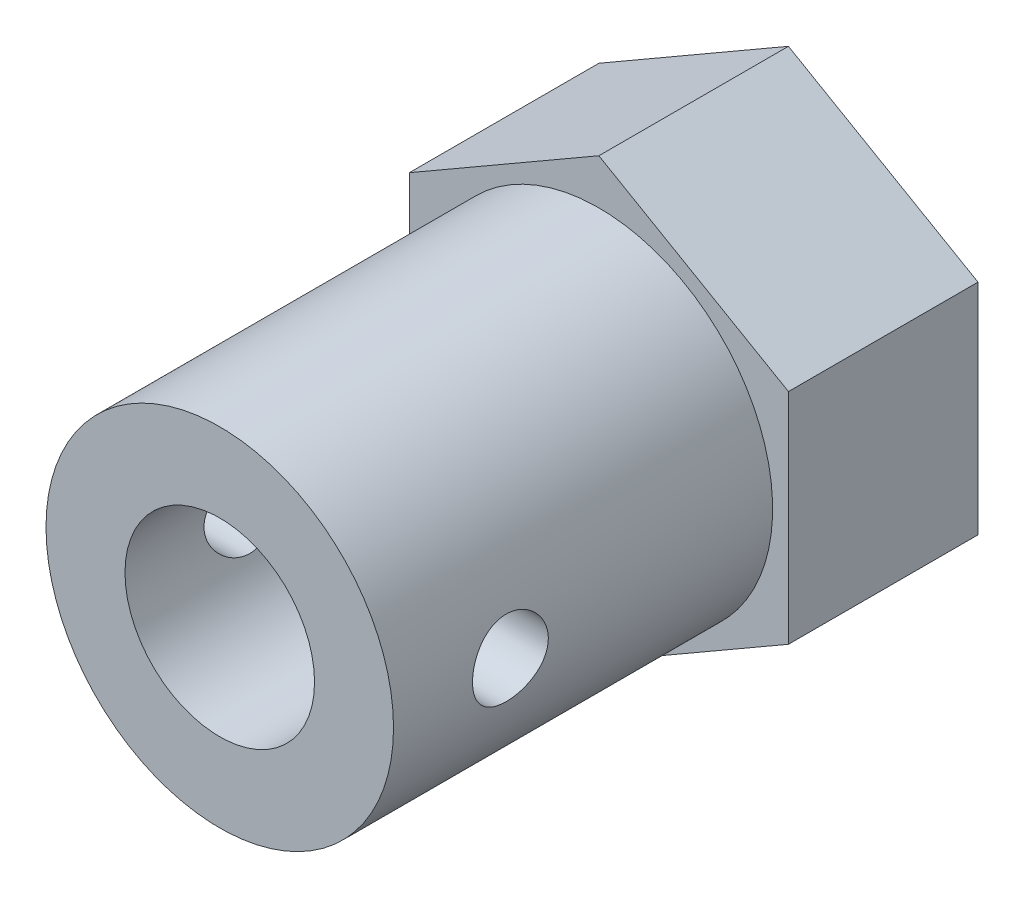
ISO-10303-21;
HEADER;
FILE_DESCRIPTION(('STEP AP214'),'2;1');
FILE_NAME('part.step','',(''),(''),'','','');
FILE_SCHEMA(('AUTOMOTIVE_DESIGN { 1 0 10303 214 1 1 1 1 }'));
ENDSEC;
DATA;
#1=APPLICATION_CONTEXT('core data for automotive mechanical design processes');
#2=APPLICATION_PROTOCOL_DEFINITION('international standard','automotive_design',2000,#1);
#3=PRODUCT_CONTEXT('',#1,'mechanical');
#4=PRODUCT('Part','Part','',(#3));
#5=PRODUCT_RELATED_PRODUCT_CATEGORY('part','',(#4));
#6=PRODUCT_DEFINITION_FORMATION('','',#4);
#7=PRODUCT_DEFINITION_CONTEXT('part definition',#1,'design');
#8=PRODUCT_DEFINITION('design','',#6,#7);
#9=PRODUCT_DEFINITION_SHAPE('','',#8);
#10=(LENGTH_UNIT() NAMED_UNIT(*) SI_UNIT(.MILLI.,.METRE.));
#11=(NAMED_UNIT(*) PLANE_ANGLE_UNIT() SI_UNIT($,.RADIAN.));
#12=(NAMED_UNIT(*) SI_UNIT($,.STERADIAN.) SOLID_ANGLE_UNIT());
#13=UNCERTAINTY_MEASURE_WITH_UNIT(LENGTH_MEASURE(1.E-05),#10,'distance_accuracy_value','');
#14=(GEOMETRIC_REPRESENTATION_CONTEXT(3) GLOBAL_UNCERTAINTY_ASSIGNED_CONTEXT((#13)) GLOBAL_UNIT_ASSIGNED_CONTEXT((#10,
#11,#12)) REPRESENTATION_CONTEXT('',''));
#15=CARTESIAN_POINT('',(0.,0.,0.));
#16=DIRECTION('',(0.,0.,1.));
#17=DIRECTION('',(1.,0.,0.));
#18=AXIS2_PLACEMENT_3D('',#15,#16,#17);
#19=CARTESIAN_POINT('',(-6.,0.,8.3));
#20=DIRECTION('',(1.,0.,0.));
#21=DIRECTION('',(0.,0.,-1.));
#22=AXIS2_PLACEMENT_3D('',#19,#20,#21);
#23=CYLINDRICAL_SURFACE('',#22,1.2);
#24=CARTESIAN_POINT('',(-3.,0.,7.1));
#25=CARTESIAN_POINT('',(-2.99999562736251,0.0644958032657348,7.10000591109424));
#26=CARTESIAN_POINT('',(-2.9978957658416,0.129103538454404,7.10523065125303));
#27=CARTESIAN_POINT('',(-2.98970071860385,0.256497888250737,7.12594862211274));
#28=CARTESIAN_POINT('',(-2.98359467219326,0.319279066536749,7.14146976745168));
#29=CARTESIAN_POINT('',(-2.96804525527871,0.440972353636442,7.1821256468353));
#30=CARTESIAN_POINT('',(-2.95861281818443,0.499896396970175,7.20722890773004));
#31=CARTESIAN_POINT('',(-2.93733966477647,0.61264318219702,7.26621150399593));
#32=CARTESIAN_POINT('',(-2.92549978474834,0.666467686050595,7.30008779295136));
#33=CARTESIAN_POINT('',(-2.89998531702251,0.770100604542236,7.37734129913656));
#34=CARTESIAN_POINT('',(-2.88625378157514,0.819637363530127,7.42106399374416));
#35=CARTESIAN_POINT('',(-2.85876346143717,0.910905002870833,7.51604000208607));
#36=CARTESIAN_POINT('',(-2.84500466672275,0.952632064280119,7.56729697832704));
#37=CARTESIAN_POINT('',(-2.81833675078282,1.02892474037573,7.67865684214536));
#38=CARTESIAN_POINT('',(-2.80549269578971,1.06308898871728,7.73905189161392));
#39=CARTESIAN_POINT('',(-2.78300188312076,1.12065283142229,7.86532183905203));
#40=CARTESIAN_POINT('',(-2.77335360746506,1.1440575385715,7.93119411670902));
#41=CARTESIAN_POINT('',(-2.75895814596491,1.17833929403752,8.06342740015526));
#42=CARTESIAN_POINT('',(-2.75400852213363,1.18973637948339,8.12963074134573));
#43=CARTESIAN_POINT('',(-2.74898402429486,1.20130377698402,8.26318099898436));
#44=CARTESIAN_POINT('',(-2.74890675313661,1.20147960978793,8.33052733677501));
#45=CARTESIAN_POINT('',(-2.75346300167997,1.19099362050273,8.45945400287483));
#46=CARTESIAN_POINT('',(-2.7577690502307,1.18108518858308,8.52110942864542));
#47=CARTESIAN_POINT('',(-2.77005712564702,1.15196812817869,8.64179573360403));
#48=CARTESIAN_POINT('',(-2.77803979393004,1.13275787688278,8.70082615286619));
#49=CARTESIAN_POINT('',(-2.79695691053118,1.08521683953064,8.81601070171763));
#50=CARTESIAN_POINT('',(-2.80794827568473,1.05670791738919,8.87208154343281));
#51=CARTESIAN_POINT('',(-2.83162869833934,0.991503876439327,8.97884948981694));
#52=CARTESIAN_POINT('',(-2.84431839274109,0.954805683060505,9.02954456564168));
#53=CARTESIAN_POINT('',(-2.87116042045363,0.87093035967266,9.1282458372812));
#54=CARTESIAN_POINT('',(-2.88534998985691,0.82316247778238,9.17574123766761));
#55=CARTESIAN_POINT('',(-2.91275894974969,0.720188656458115,9.26221068680122));
#56=CARTESIAN_POINT('',(-2.92597814667195,0.66498123920066,9.30118303844618));
#57=CARTESIAN_POINT('',(-2.95028808758729,0.547246591563506,9.3701704684495));
#58=CARTESIAN_POINT('',(-2.96133162057249,0.484596294807886,9.39999336871823));
#59=CARTESIAN_POINT('',(-2.97968896997255,0.354614259289729,9.44850071664683));
#60=CARTESIAN_POINT('',(-2.98700468077429,0.287284918109804,9.46719082253444));
#61=CARTESIAN_POINT('',(-2.99673683704146,0.154137532564692,9.49186897725182));
#62=CARTESIAN_POINT('',(-2.99941767500109,0.0884659763913206,9.49854347255213));
#63=CARTESIAN_POINT('',(-3.00041087106379,-0.0431071858846905,9.50102786031717));
#64=CARTESIAN_POINT('',(-2.99872436149375,-0.109008727934354,9.49684056892851));
#65=CARTESIAN_POINT('',(-2.99134540238252,-0.236059643473193,9.4782249484688));
#66=CARTESIAN_POINT('',(-2.98583634807314,-0.297289495065285,9.46426521178942));
#67=CARTESIAN_POINT('',(-2.971556648433,-0.416481256836469,9.42713857501411));
#68=CARTESIAN_POINT('',(-2.96278558413918,-0.474442746134907,9.40397049219879));
#69=CARTESIAN_POINT('',(-2.94249956862487,-0.587447271490021,9.34832903619203));
#70=CARTESIAN_POINT('',(-2.93090889587882,-0.642346813653243,9.31559271677411));
#71=CARTESIAN_POINT('',(-2.90624018847315,-0.746066154747933,9.24203580565661));
#72=CARTESIAN_POINT('',(-2.89316155866162,-0.794883504456675,9.20121197424643));
#73=CARTESIAN_POINT('',(-2.86587070582867,-0.88843382581729,9.10947799223023));
#74=CARTESIAN_POINT('',(-2.85164064855031,-0.932684360283637,9.05807987509628));
#75=CARTESIAN_POINT('',(-2.82445003750279,-1.01205071844823,8.94833595019438));
#76=CARTESIAN_POINT('',(-2.81148969315907,-1.0471650368025,8.88998899979603));
#77=CARTESIAN_POINT('',(-2.78828579944625,-1.10748450115898,8.76712298324354));
#78=CARTESIAN_POINT('',(-2.77806978530873,-1.13259035672067,8.70254960047261));
#79=CARTESIAN_POINT('',(-2.76194204086759,-1.17137773182318,8.56955980897091));
#80=CARTESIAN_POINT('',(-2.75602713417599,-1.18506768316159,8.50114627651254));
#81=CARTESIAN_POINT('',(-2.74963055579956,-1.19982937036704,8.36772325893527));
#82=CARTESIAN_POINT('',(-2.74878852604903,-1.20173824938172,8.30282309624399));
#83=CARTESIAN_POINT('',(-2.75168901619859,-1.19508189556651,8.17367308537202));
#84=CARTESIAN_POINT('',(-2.75543095394876,-1.18651799274827,8.10942315565845));
#85=CARTESIAN_POINT('',(-2.76675989447412,-1.15984281969219,7.98600068608698));
#86=CARTESIAN_POINT('',(-2.7741889909647,-1.14212249614259,7.9267278353402));
#87=CARTESIAN_POINT('',(-2.79194400739618,-1.09800326909461,7.81197282223191));
#88=CARTESIAN_POINT('',(-2.80227072723604,-1.07160196883629,7.7564917118601));
#89=CARTESIAN_POINT('',(-2.82539165762695,-1.00912365765584,7.64743422843753));
#90=CARTESIAN_POINT('',(-2.83829329387945,-0.972579201095693,7.59414879792171));
#91=CARTESIAN_POINT('',(-2.86478282623342,-0.891535271562897,7.49420400967775));
#92=CARTESIAN_POINT('',(-2.87837092829044,-0.847033400890872,7.44754665672301));
#93=CARTESIAN_POINT('',(-2.90576140252436,-0.747903303763477,7.35907828804183));
#94=CARTESIAN_POINT('',(-2.91952054777311,-0.692805600687682,7.31777761586116));
#95=CARTESIAN_POINT('',(-2.9448024402823,-0.575940192171467,7.24499777442702));
#96=CARTESIAN_POINT('',(-2.95632414655744,-0.514169402728342,7.21352317270848));
#97=CARTESIAN_POINT('',(-2.97563828889517,-0.386842837497121,7.16202667088583));
#98=CARTESIAN_POINT('',(-2.98349617833017,-0.321378970931817,7.1418024058638));
#99=CARTESIAN_POINT('',(-2.99486583725619,-0.187725927768732,7.11281652742744));
#100=CARTESIAN_POINT('',(-2.99839139697383,-0.119546115515347,7.10401853795366));
#101=CARTESIAN_POINT('',(-2.99985539702482,-0.0341473787345575,7.10036277141304));
#102=CARTESIAN_POINT('',(-3.00000115781505,-0.0170776132444549,7.09999843482248));
#103=CARTESIAN_POINT('',(-3.,0.,7.1));
#104=B_SPLINE_CURVE_WITH_KNOTS('',3,(#24,#25,#26,#27,#28,#29,#30,#31,#32,#33,#34,#35,#36,#37,
#38,#39,#40,#41,#42,#43,#44,#45,#46,#47,#48,#49,#50,#51,#52,#53,#54,#55,#56,#57,#58,#59,#60,#61,
#62,#63,#64,#65,#66,#67,#68,#69,#70,#71,#72,#73,#74,#75,#76,#77,#78,#79,#80,#81,#82,#83,#84,#85,
#86,#87,#88,#89,#90,#91,#92,#93,#94,#95,#96,#97,#98,#99,#100,#101,#102,#103),.UNSPECIFIED.,.T.,
.F.,(4,2,2,2,2,2,2,2,2,2,2,2,2,2,2,2,2,2,2,2,2,2,2,2,2,2,2,2,2,2,2,2,2,2,2,2,2,2,2,4),(0.,
0.193441792735843,0.38741018160476,0.580746874482949,0.774016521407905,0.975584290202382,
1.17725036960647,1.3878915529153,1.59843253870961,1.79942463185297,2.00031783804293,
2.18722997040823,2.37417472353628,2.56493475779289,2.7557665316291,2.96135009511934,
3.16697455703839,3.37666147897683,3.58624173668274,3.78341510716804,3.98053736142049,
4.16880273338619,4.35709229396278,4.55114108038957,4.74526775699381,4.95221084774648,
5.15918801426249,5.36817027084496,5.5769980358756,5.77079804035649,5.96457343537827,
6.15068591129261,6.33684981483097,6.53367280834015,6.73055520809036,6.94020254120301,
7.1499471818432,7.35578580607991,7.56096751442605,7.61218827538077),.UNSPECIFIED.);
#105=CARTESIAN_POINT('',(-3.,0.,7.1));
#106=VERTEX_POINT('',#105);
#107=EDGE_CURVE('E40',#106,#106,#104,.T.);
#108=ORIENTED_EDGE('',*,*,#107,.T.);
#109=EDGE_LOOP('',(#108));
#110=FACE_BOUND('',#109,.T.);
#111=CARTESIAN_POINT('',(-5.5,0.,9.5));
#112=CARTESIAN_POINT('',(-5.49999877175332,-0.0665593022598047,9.49999772123046));
#113=CARTESIAN_POINT('',(-5.49877949864659,-0.133146179260507,9.49444362844893));
#114=CARTESIAN_POINT('',(-5.49403334077481,-0.264428834223227,9.47239690613744));
#115=CARTESIAN_POINT('',(-5.49050480148522,-0.329123221524071,9.45589643371714));
#116=CARTESIAN_POINT('',(-5.48153302039319,-0.454704588467653,9.41249814619925));
#117=CARTESIAN_POINT('',(-5.47609177416362,-0.51559545873099,9.385611164713));
#118=CARTESIAN_POINT('',(-5.46388197129955,-0.631999612922457,9.32223739518187));
#119=CARTESIAN_POINT('',(-5.45711345036056,-0.687513041410716,9.28575086529677));
#120=CARTESIAN_POINT('',(-5.44286981280129,-0.792475316745435,9.20359699818128));
#121=CARTESIAN_POINT('',(-5.43538596892984,-0.841825983276221,9.15780572505087));
#122=CARTESIAN_POINT('',(-5.42061671560862,-0.932210576690611,9.05860829493134));
#123=CARTESIAN_POINT('',(-5.41333132383164,-0.97324376495881,9.00520146237593));
#124=CARTESIAN_POINT('',(-5.39969782653284,-1.04626133911395,8.89156361207369));
#125=CARTESIAN_POINT('',(-5.39336090520738,-1.07814129102466,8.83126402904575));
#126=CARTESIAN_POINT('',(-5.38246705853285,-1.13127756964438,8.70600236769513));
#127=CARTESIAN_POINT('',(-5.37790992150466,-1.15253515981086,8.64104084493004));
#128=CARTESIAN_POINT('',(-5.37118047901818,-1.18349898897918,8.50936407235088));
#129=CARTESIAN_POINT('',(-5.36897233588208,-1.1933790096853,8.44269155798706));
#130=CARTESIAN_POINT('',(-5.36708325363359,-1.2018475759635,8.3086015471859));
#131=CARTESIAN_POINT('',(-5.36740200548858,-1.20043750228434,8.24118414285368));
#132=CARTESIAN_POINT('',(-5.37049825004496,-1.18650577616869,8.10880940780274));
#133=CARTESIAN_POINT('',(-5.37323108677155,-1.17418592369556,8.04382963601044));
#134=CARTESIAN_POINT('',(-5.38077698405873,-1.13910403230554,7.91688202564023));
#135=CARTESIAN_POINT('',(-5.38559016080624,-1.11634141015595,7.85491435550317));
#136=CARTESIAN_POINT('',(-5.39679846975023,-1.06083460553992,7.73518224505646));
#137=CARTESIAN_POINT('',(-5.40320583559669,-1.028012755553,7.6774550036372));
#138=CARTESIAN_POINT('',(-5.4168730596702,-0.953373804681217,7.56825281988827));
#139=CARTESIAN_POINT('',(-5.42413303349461,-0.911555483405801,7.51677872729533));
#140=CARTESIAN_POINT('',(-5.43887911316364,-0.819042067056946,7.42038210107529));
#141=CARTESIAN_POINT('',(-5.44636672375906,-0.768175356167151,7.37562433838152));
#142=CARTESIAN_POINT('',(-5.46058215343989,-0.659573288071375,7.29524792896919));
#143=CARTESIAN_POINT('',(-5.46730995889372,-0.601837807671672,7.25962944620291));
#144=CARTESIAN_POINT('',(-5.47926940371413,-0.480936524679595,7.19850226610263));
#145=CARTESIAN_POINT('',(-5.48449785360299,-0.417759512257273,7.17301507658765));
#146=CARTESIAN_POINT('',(-5.4928457593274,-0.287880059997284,7.1330640890064));
#147=CARTESIAN_POINT('',(-5.49596552027762,-0.22117813170039,7.11859869611354));
#148=CARTESIAN_POINT('',(-5.49970113499559,-0.0875557067972114,7.10134138690711));
#149=CARTESIAN_POINT('',(-5.50036526326622,-0.0206655918824449,7.09832437885616));
#150=CARTESIAN_POINT('',(-5.49925002549543,0.112662870798247,7.10343949833456));
#151=CARTESIAN_POINT('',(-5.49747082431789,0.179101248741191,7.11157087362567));
#152=CARTESIAN_POINT('',(-5.4916992990669,0.308895091246409,7.13856528403167));
#153=CARTESIAN_POINT('',(-5.48773131821101,0.372276272400871,7.15731033537906));
#154=CARTESIAN_POINT('',(-5.47802633395301,0.494994801330721,7.20486909879334));
#155=CARTESIAN_POINT('',(-5.47228918036233,0.554331805265541,7.23368366570898));
#156=CARTESIAN_POINT('',(-5.45956312888817,0.668208929334491,7.30103305380549));
#157=CARTESIAN_POINT('',(-5.45255759903569,0.722668885406483,7.33970020721688));
#158=CARTESIAN_POINT('',(-5.43810598941819,0.82440790823029,7.42548280058166));
#159=CARTESIAN_POINT('',(-5.43065985282472,0.871686045870168,7.47259933191482));
#160=CARTESIAN_POINT('',(-5.4159996388904,0.958608650712916,7.57497586131205));
#161=CARTESIAN_POINT('',(-5.40879231781763,0.99809729291888,7.63036930868786));
#162=CARTESIAN_POINT('',(-5.39558170072418,1.06721190199994,7.74713409440553));
#163=CARTESIAN_POINT('',(-5.38957835270314,1.0968382948682,7.80850517439955));
#164=CARTESIAN_POINT('',(-5.37951253782245,1.14518787891213,7.93515447625434));
#165=CARTESIAN_POINT('',(-5.37543920341442,1.16397225337523,8.00040843450684));
#166=CARTESIAN_POINT('',(-5.36967491565847,1.19028401626766,8.13324682460152));
#167=CARTESIAN_POINT('',(-5.36798358352902,1.19781319448882,8.2008308841639));
#168=CARTESIAN_POINT('',(-5.36719858261017,1.20132496329617,8.33484007321889));
#169=CARTESIAN_POINT('',(-5.36804933495448,1.19755459610233,8.40125852261637));
#170=CARTESIAN_POINT('',(-5.37212699483712,1.17912637057917,8.53248926032741));
#171=CARTESIAN_POINT('',(-5.37535387466365,1.16446863922473,8.59730156736364));
#172=CARTESIAN_POINT('',(-5.3837931755868,1.12480084746293,8.72328518141112));
#173=CARTESIAN_POINT('',(-5.38899872891456,1.09982656898761,8.78446824541945));
#174=CARTESIAN_POINT('',(-5.40081157116181,1.04026541322778,8.90181270714263));
#175=CARTESIAN_POINT('',(-5.40741900526288,1.00567754022509,8.95797358389276));
#176=CARTESIAN_POINT('',(-5.42145726522213,0.92705088705161,9.06489765742971));
#177=CARTESIAN_POINT('',(-5.42890198147138,0.882835977498081,9.11552953830767));
#178=CARTESIAN_POINT('',(-5.44368244395535,0.786567481766073,9.20873612869708));
#179=CARTESIAN_POINT('',(-5.45101816460935,0.734512086420355,9.25130897348131));
#180=CARTESIAN_POINT('',(-5.46486626125455,0.623231493767946,9.32771430253936));
#181=CARTESIAN_POINT('',(-5.47136680134678,0.563922502993448,9.36142700976282));
#182=CARTESIAN_POINT('',(-5.48269342674045,0.440350639874021,9.41835175544085));
#183=CARTESIAN_POINT('',(-5.48752091867236,0.376091984841176,9.44157262002166));
#184=CARTESIAN_POINT('',(-5.49409388342486,0.259805649911634,9.47270531882534));
#185=CARTESIAN_POINT('',(-5.49629498130902,0.208408097543254,9.48292133295661));
#186=CARTESIAN_POINT('',(-5.49924849080449,0.104679354994678,9.49656942077358));
#187=CARTESIAN_POINT('',(-5.50000096600337,0.0523482058966677,9.50000179222878));
#188=CARTESIAN_POINT('',(-5.5,0.,9.5));
#189=B_SPLINE_CURVE_WITH_KNOTS('',3,(#111,#112,#113,#114,#115,#116,#117,#118,#119,#120,#121,
#122,#123,#124,#125,#126,#127,#128,#129,#130,#131,#132,#133,#134,#135,#136,#137,#138,#139,#140,
#141,#142,#143,#144,#145,#146,#147,#148,#149,#150,#151,#152,#153,#154,#155,#156,#157,#158,#159,
#160,#161,#162,#163,#164,#165,#166,#167,#168,#169,#170,#171,#172,#173,#174,#175,#176,#177,#178,
#179,#180,#181,#182,#183,#184,#185,#186,#187,#188),.UNSPECIFIED.,.T.,.F.,(4,2,2,2,2,2,2,2,2,2,2,
2,2,2,2,2,2,2,2,2,2,2,2,2,2,2,2,2,2,2,2,2,2,2,2,2,2,2,4),(0.,0.199486294518104,
0.399115672080402,0.598537386711283,0.797953738860321,1.00022447712909,1.20251316974528,
1.40702565840789,1.61151381591134,1.81283535626371,2.01413227589907,2.21178178225925,
2.40944232876454,2.60866919694884,2.80792310774349,3.01146367164206,3.2150078866605,
3.4189819290223,3.62292645123918,3.82283970770139,4.02273947566091,4.22045955577461,
4.41819642535926,4.6187437083923,4.81931691417438,5.02356694561993,5.22780815347877,
5.43088523286119,5.6339300156613,5.83256824379213,6.03120415532306,6.22915682646588,
6.4271300079984,6.62908588915635,6.83108844258878,7.03569563508706,7.24013038250514,
7.39703118647275,7.55392510309218),.UNSPECIFIED.);
#190=CARTESIAN_POINT('',(-5.5,0.,9.5));
#191=VERTEX_POINT('',#190);
#192=EDGE_CURVE('E132',#191,#191,#189,.T.);
#193=ORIENTED_EDGE('',*,*,#192,.F.);
#194=EDGE_LOOP('',(#193));
#195=FACE_BOUND('',#194,.T.);
#196=ADVANCED_FACE('F35',(#110,#195),#23,.F.);
#197=CARTESIAN_POINT('',(0.,0.,12.));
#198=DIRECTION('',(0.,0.,-1.));
#199=DIRECTION('',(-1.,0.,0.));
#200=AXIS2_PLACEMENT_3D('',#197,#198,#199);
#201=CYLINDRICAL_SURFACE('',#200,5.5);
#202=ORIENTED_EDGE('',*,*,#192,.T.);
#203=EDGE_LOOP('',(#202));
#204=FACE_BOUND('',#203,.T.);
#205=CARTESIAN_POINT('',(5.5,0.,7.1));
#206=CARTESIAN_POINT('',(5.49999877175332,-0.0665593022598047,7.10000227876954));
#207=CARTESIAN_POINT('',(5.49877949864659,-0.133146179260507,7.10555637155107));
#208=CARTESIAN_POINT('',(5.49403334077481,-0.264428834223227,7.12760309386256));
#209=CARTESIAN_POINT('',(5.49050480148522,-0.32912322152407,7.14410356628287));
#210=CARTESIAN_POINT('',(5.48153302039319,-0.454704588467652,7.18750185380075));
#211=CARTESIAN_POINT('',(5.47609177416362,-0.515595458730989,7.214388835287));
#212=CARTESIAN_POINT('',(5.46388197129955,-0.631999612922456,7.27776260481813));
#213=CARTESIAN_POINT('',(5.45711345036056,-0.687513041410715,7.31424913470323));
#214=CARTESIAN_POINT('',(5.44286981280129,-0.792475316745435,7.39640300181872));
#215=CARTESIAN_POINT('',(5.43538596892984,-0.841825983276222,7.44219427494913));
#216=CARTESIAN_POINT('',(5.42061671560862,-0.932210576690612,7.54139170506866));
#217=CARTESIAN_POINT('',(5.41333132383164,-0.97324376495881,7.59479853762407));
#218=CARTESIAN_POINT('',(5.39969782653284,-1.04626133911395,7.70843638792631));
#219=CARTESIAN_POINT('',(5.39336090520738,-1.07814129102467,7.76873597095425));
#220=CARTESIAN_POINT('',(5.38246705853285,-1.13127756964438,7.89399763230487));
#221=CARTESIAN_POINT('',(5.37790992150466,-1.15253515981086,7.95895915506996));
#222=CARTESIAN_POINT('',(5.37118047901818,-1.18349898897918,8.09063592764912));
#223=CARTESIAN_POINT('',(5.36897233588208,-1.1933790096853,8.15730844201294));
#224=CARTESIAN_POINT('',(5.36708325363359,-1.2018475759635,8.29139845281409));
#225=CARTESIAN_POINT('',(5.36740200548858,-1.20043750228434,8.35881585714632));
#226=CARTESIAN_POINT('',(5.37049825004496,-1.18650577616869,8.49119059219726));
#227=CARTESIAN_POINT('',(5.37323108677155,-1.17418592369556,8.55617036398956));
#228=CARTESIAN_POINT('',(5.38077698405873,-1.13910403230554,8.68311797435977));
#229=CARTESIAN_POINT('',(5.38559016080624,-1.11634141015595,8.74508564449683));
#230=CARTESIAN_POINT('',(5.39679846975023,-1.06083460553992,8.86481775494354));
#231=CARTESIAN_POINT('',(5.40320583559669,-1.02801275555301,8.9225449963628));
#232=CARTESIAN_POINT('',(5.4168730596702,-0.953373804681217,9.03174718011173));
#233=CARTESIAN_POINT('',(5.42413303349461,-0.911555483405801,9.08322127270467));
#234=CARTESIAN_POINT('',(5.43887911316364,-0.819042067056946,9.17961789892471));
#235=CARTESIAN_POINT('',(5.44636672375906,-0.768175356167151,9.22437566161848));
#236=CARTESIAN_POINT('',(5.46058215343989,-0.659573288071375,9.3047520710308));
#237=CARTESIAN_POINT('',(5.46730995889372,-0.601837807671673,9.34037055379709));
#238=CARTESIAN_POINT('',(5.47926940371413,-0.480936524679596,9.40149773389737));
#239=CARTESIAN_POINT('',(5.48449785360299,-0.417759512257274,9.42698492341235));
#240=CARTESIAN_POINT('',(5.4928457593274,-0.287880059997284,9.4669359109936));
#241=CARTESIAN_POINT('',(5.49596552027762,-0.22117813170039,9.48140130388646));
#242=CARTESIAN_POINT('',(5.49970113499559,-0.087555706797212,9.49865861309289));
#243=CARTESIAN_POINT('',(5.50036526326622,-0.0206655918824454,9.50167562114384));
#244=CARTESIAN_POINT('',(5.49925002549543,0.112662870798247,9.49656050166544));
#245=CARTESIAN_POINT('',(5.49747082431789,0.179101248741191,9.48842912637433));
#246=CARTESIAN_POINT('',(5.4916992990669,0.308895091246409,9.46143471596833));
#247=CARTESIAN_POINT('',(5.48773131821101,0.372276272400871,9.44268966462094));
#248=CARTESIAN_POINT('',(5.47802633395301,0.494994801330721,9.39513090120666));
#249=CARTESIAN_POINT('',(5.47228918036233,0.554331805265541,9.36631633429102));
#250=CARTESIAN_POINT('',(5.45956312888817,0.668208929334492,9.29896694619451));
#251=CARTESIAN_POINT('',(5.45255759903569,0.722668885406483,9.26029979278312));
#252=CARTESIAN_POINT('',(5.43810598941819,0.82440790823029,9.17451719941834));
#253=CARTESIAN_POINT('',(5.43065985282472,0.871686045870168,9.12740066808519));
#254=CARTESIAN_POINT('',(5.4159996388904,0.958608650712916,9.02502413868795));
#255=CARTESIAN_POINT('',(5.40879231781763,0.99809729291888,8.96963069131214));
#256=CARTESIAN_POINT('',(5.39558170072418,1.06721190199994,8.85286590559447));
#257=CARTESIAN_POINT('',(5.38957835270314,1.0968382948682,8.79149482560045));
#258=CARTESIAN_POINT('',(5.37951253782245,1.14518787891213,8.66484552374566));
#259=CARTESIAN_POINT('',(5.37543920341442,1.16397225337523,8.59959156549316));
#260=CARTESIAN_POINT('',(5.36967491565847,1.19028401626766,8.46675317539847));
#261=CARTESIAN_POINT('',(5.36798358352902,1.19781319448882,8.3991691158361));
#262=CARTESIAN_POINT('',(5.36719858261017,1.20132496329617,8.26515992678111));
#263=CARTESIAN_POINT('',(5.36804933495448,1.19755459610233,8.19874147738363));
#264=CARTESIAN_POINT('',(5.37212699483712,1.17912637057917,8.06751073967258));
#265=CARTESIAN_POINT('',(5.37535387466365,1.16446863922473,8.00269843263636));
#266=CARTESIAN_POINT('',(5.3837931755868,1.12480084746293,7.87671481858888));
#267=CARTESIAN_POINT('',(5.38899872891456,1.09982656898761,7.81553175458055));
#268=CARTESIAN_POINT('',(5.40081157116181,1.04026541322778,7.69818729285737));
#269=CARTESIAN_POINT('',(5.40741900526288,1.00567754022509,7.64202641610724));
#270=CARTESIAN_POINT('',(5.42145726522213,0.92705088705161,7.53510234257029));
#271=CARTESIAN_POINT('',(5.42890198147138,0.882835977498082,7.48447046169233));
#272=CARTESIAN_POINT('',(5.44368244395535,0.786567481766074,7.39126387130292));
#273=CARTESIAN_POINT('',(5.45101816460935,0.734512086420356,7.34869102651869));
#274=CARTESIAN_POINT('',(5.46486626125455,0.623231493767946,7.27228569746065));
#275=CARTESIAN_POINT('',(5.47136680134678,0.563922502993449,7.23857299023718));
#276=CARTESIAN_POINT('',(5.48269342674045,0.440350639874022,7.18164824455915));
#277=CARTESIAN_POINT('',(5.48752091867236,0.376091984841176,7.15842737997834));
#278=CARTESIAN_POINT('',(5.49409388342486,0.259805649911635,7.12729468117466));
#279=CARTESIAN_POINT('',(5.49629498130902,0.208408097543254,7.11707866704339));
#280=CARTESIAN_POINT('',(5.49924849080449,0.104679354994679,7.10343057922642));
#281=CARTESIAN_POINT('',(5.50000096600337,0.052348205896668,7.09999820777122));
#282=CARTESIAN_POINT('',(5.5,0.,7.1));
#283=B_SPLINE_CURVE_WITH_KNOTS('',3,(#205,#206,#207,#208,#209,#210,#211,#212,#213,#214,#215,
#216,#217,#218,#219,#220,#221,#222,#223,#224,#225,#226,#227,#228,#229,#230,#231,#232,#233,#234,
#235,#236,#237,#238,#239,#240,#241,#242,#243,#244,#245,#246,#247,#248,#249,#250,#251,#252,#253,
#254,#255,#256,#257,#258,#259,#260,#261,#262,#263,#264,#265,#266,#267,#268,#269,#270,#271,#272,
#273,#274,#275,#276,#277,#278,#279,#280,#281,#282),.UNSPECIFIED.,.T.,.F.,(4,2,2,2,2,2,2,2,2,2,2,
2,2,2,2,2,2,2,2,2,2,2,2,2,2,2,2,2,2,2,2,2,2,2,2,2,2,2,4),(0.,0.199486294518104,
0.399115672080402,0.598537386711283,0.797953738860321,1.00022447712909,1.20251316974528,
1.40702565840789,1.61151381591134,1.81283535626371,2.01413227589907,2.21178178225925,
2.40944232876454,2.60866919694884,2.80792310774349,3.01146367164206,3.2150078866605,
3.4189819290223,3.62292645123918,3.82283970770139,4.02273947566091,4.2204595557746,
4.41819642535926,4.6187437083923,4.81931691417438,5.02356694561993,5.22780815347877,
5.43088523286119,5.6339300156613,5.83256824379214,6.03120415532306,6.22915682646588,
6.4271300079984,6.62908588915635,6.83108844258878,7.03569563508706,7.24013038250514,
7.39703118647275,7.55392510309218),.UNSPECIFIED.);
#284=CARTESIAN_POINT('',(5.5,0.,7.1));
#285=VERTEX_POINT('',#284);
#286=EDGE_CURVE('E150',#285,#285,#283,.T.);
#287=ORIENTED_EDGE('',*,*,#286,.T.);
#288=EDGE_LOOP('',(#287));
#289=FACE_BOUND('',#288,.T.);
#290=CARTESIAN_POINT('',(0.,0.,12.));
#291=DIRECTION('',(0.,0.,1.));
#292=DIRECTION('',(1.,0.,0.));
#293=AXIS2_PLACEMENT_3D('',#290,#291,#292);
#294=CIRCLE('',#293,5.5);
#295=CARTESIAN_POINT('',(5.5,0.,12.));
#296=VERTEX_POINT('',#295);
#297=EDGE_CURVE('E12',#296,#296,#294,.T.);
#298=ORIENTED_EDGE('',*,*,#297,.F.);
#299=EDGE_LOOP('',(#298));
#300=FACE_BOUND('',#299,.T.);
#301=CARTESIAN_POINT('',(0.,0.,0.));
#302=DIRECTION('',(0.,0.,-1.));
#303=DIRECTION('',(-1.,0.,0.));
#304=AXIS2_PLACEMENT_3D('',#301,#302,#303);
#305=CIRCLE('',#304,5.5);
#306=CARTESIAN_POINT('',(-5.5,0.,0.));
#307=VERTEX_POINT('',#306);
#308=EDGE_CURVE('E50',#307,#307,#305,.T.);
#309=ORIENTED_EDGE('',*,*,#308,.F.);
#310=EDGE_LOOP('',(#309));
#311=FACE_BOUND('',#310,.T.);
#312=ADVANCED_FACE('F37',(#204,#289,#300,#311),#201,.T.);
#313=CARTESIAN_POINT('',(0.,0.,12.));
#314=DIRECTION('',(0.,0.,1.));
#315=DIRECTION('',(1.,0.,0.));
#316=AXIS2_PLACEMENT_3D('',#313,#314,#315);
#317=PLANE('',#316);
#318=CARTESIAN_POINT('',(0.,0.,12.));
#319=DIRECTION('',(0.,0.,1.));
#320=DIRECTION('',(1.,0.,0.));
#321=AXIS2_PLACEMENT_3D('',#318,#319,#320);
#322=CIRCLE('',#321,3.);
#323=CARTESIAN_POINT('',(3.,0.,12.));
#324=VERTEX_POINT('',#323);
#325=EDGE_CURVE('E243',#324,#324,#322,.T.);
#326=ORIENTED_EDGE('',*,*,#325,.F.);
#327=EDGE_LOOP('',(#326));
#328=FACE_BOUND('',#327,.T.);
#329=ORIENTED_EDGE('',*,*,#297,.T.);
#330=EDGE_LOOP('',(#329));
#331=FACE_BOUND('',#330,.T.);
#332=ADVANCED_FACE('F194',(#328,#331),#317,.T.);
#333=CARTESIAN_POINT('',(0.,-6.92820323027551,-6.));
#334=DIRECTION('',(0.5,0.866025403784439,0.));
#335=DIRECTION('',(-0.866025403784439,0.5,0.));
#336=AXIS2_PLACEMENT_3D('',#333,#334,#335);
#337=PLANE('',#336);
#338=DIRECTION('',(-0.866025403784439,0.5,0.));
#339=VECTOR('',#338,1.);
#340=CARTESIAN_POINT('',(0.,-6.92820323027551,0.));
#341=LINE('',#340,#339);
#342=CARTESIAN_POINT('',(0.,-6.92820323027551,0.));
#343=VERTEX_POINT('',#342);
#344=CARTESIAN_POINT('',(-6.,-3.46410161513776,0.));
#345=VERTEX_POINT('',#344);
#346=EDGE_CURVE('E128',#343,#345,#341,.T.);
#347=ORIENTED_EDGE('',*,*,#346,.T.);
#348=DIRECTION('',(0.,0.,1.));
#349=VECTOR('',#348,1.);
#350=CARTESIAN_POINT('',(-6.,-3.46410161513776,-6.));
#351=LINE('',#350,#349);
#352=CARTESIAN_POINT('',(-6.,-3.46410161513776,-6.));
#353=VERTEX_POINT('',#352);
#354=EDGE_CURVE('E146',#353,#345,#351,.T.);
#355=ORIENTED_EDGE('',*,*,#354,.F.);
#356=DIRECTION('',(-0.866025403784439,0.5,0.));
#357=VECTOR('',#356,1.);
#358=CARTESIAN_POINT('',(0.,-6.92820323027551,-6.));
#359=LINE('',#358,#357);
#360=CARTESIAN_POINT('',(0.,-6.92820323027551,-6.));
#361=VERTEX_POINT('',#360);
#362=EDGE_CURVE('E139',#361,#353,#359,.T.);
#363=ORIENTED_EDGE('',*,*,#362,.F.);
#364=DIRECTION('',(0.,0.,1.));
#365=VECTOR('',#364,1.);
#366=CARTESIAN_POINT('',(0.,-6.92820323027551,-6.));
#367=LINE('',#366,#365);
#368=EDGE_CURVE('E124',#361,#343,#367,.T.);
#369=ORIENTED_EDGE('',*,*,#368,.T.);
#370=EDGE_LOOP('',(#347,#355,#363,#369));
#371=FACE_BOUND('',#370,.T.);
#372=ADVANCED_FACE('F214',(#371),#337,.F.);
#373=CARTESIAN_POINT('',(-6.,-3.46410161513776,-6.));
#374=DIRECTION('',(1.,0.,0.));
#375=DIRECTION('',(0.,1.,0.));
#376=AXIS2_PLACEMENT_3D('',#373,#374,#375);
#377=PLANE('',#376);
#378=DIRECTION('',(0.,1.,0.));
#379=VECTOR('',#378,1.);
#380=CARTESIAN_POINT('',(-6.,-3.46410161513776,0.));
#381=LINE('',#380,#379);
#382=CARTESIAN_POINT('',(-6.,3.46410161513776,0.));
#383=VERTEX_POINT('',#382);
#384=EDGE_CURVE('E131',#345,#383,#381,.T.);
#385=ORIENTED_EDGE('',*,*,#384,.T.);
#386=DIRECTION('',(0.,0.,1.));
#387=VECTOR('',#386,1.);
#388=CARTESIAN_POINT('',(-6.,3.46410161513776,-6.));
#389=LINE('',#388,#387);
#390=CARTESIAN_POINT('',(-6.,3.46410161513776,-6.));
#391=VERTEX_POINT('',#390);
#392=EDGE_CURVE('E143',#391,#383,#389,.T.);
#393=ORIENTED_EDGE('',*,*,#392,.F.);
#394=DIRECTION('',(0.,1.,0.));
#395=VECTOR('',#394,1.);
#396=CARTESIAN_POINT('',(-6.,-3.46410161513776,-6.));
#397=LINE('',#396,#395);
#398=EDGE_CURVE('E97',#353,#391,#397,.T.);
#399=ORIENTED_EDGE('',*,*,#398,.F.);
#400=ORIENTED_EDGE('',*,*,#354,.T.);
#401=EDGE_LOOP('',(#385,#393,#399,#400));
#402=FACE_BOUND('',#401,.T.);
#403=ADVANCED_FACE('F231',(#402),#377,.F.);
#404=CARTESIAN_POINT('',(-6.,3.46410161513776,-6.));
#405=DIRECTION('',(0.5,-0.866025403784439,0.));
#406=DIRECTION('',(0.866025403784439,0.5,0.));
#407=AXIS2_PLACEMENT_3D('',#404,#405,#406);
#408=PLANE('',#407);
#409=DIRECTION('',(0.866025403784439,0.5,0.));
#410=VECTOR('',#409,1.);
#411=CARTESIAN_POINT('',(-6.,3.46410161513776,0.));
#412=LINE('',#411,#410);
#413=CARTESIAN_POINT('',(0.,6.92820323027551,0.));
#414=VERTEX_POINT('',#413);
#415=EDGE_CURVE('E134',#383,#414,#412,.T.);
#416=ORIENTED_EDGE('',*,*,#415,.T.);
#417=DIRECTION('',(0.,0.,1.));
#418=VECTOR('',#417,1.);
#419=CARTESIAN_POINT('',(0.,6.92820323027551,-6.));
#420=LINE('',#419,#418);
#421=CARTESIAN_POINT('',(0.,6.92820323027551,-6.));
#422=VERTEX_POINT('',#421);
#423=EDGE_CURVE('E119',#422,#414,#420,.T.);
#424=ORIENTED_EDGE('',*,*,#423,.F.);
#425=DIRECTION('',(0.866025403784439,0.5,0.));
#426=VECTOR('',#425,1.);
#427=CARTESIAN_POINT('',(-6.,3.46410161513776,-6.));
#428=LINE('',#427,#426);
#429=EDGE_CURVE('E110',#391,#422,#428,.T.);
#430=ORIENTED_EDGE('',*,*,#429,.F.);
#431=ORIENTED_EDGE('',*,*,#392,.T.);
#432=EDGE_LOOP('',(#416,#424,#430,#431));
#433=FACE_BOUND('',#432,.T.);
#434=ADVANCED_FACE('F228',(#433),#408,.F.);
#435=CARTESIAN_POINT('',(0.,6.92820323027551,-6.));
#436=DIRECTION('',(-0.5,-0.866025403784439,0.));
#437=DIRECTION('',(0.866025403784439,-0.5,0.));
#438=AXIS2_PLACEMENT_3D('',#435,#436,#437);
#439=PLANE('',#438);
#440=DIRECTION('',(0.866025403784439,-0.5,0.));
#441=VECTOR('',#440,1.);
#442=CARTESIAN_POINT('',(0.,6.92820323027551,0.));
#443=LINE('',#442,#441);
#444=CARTESIAN_POINT('',(6.,3.46410161513776,0.));
#445=VERTEX_POINT('',#444);
#446=EDGE_CURVE('E118',#414,#445,#443,.T.);
#447=ORIENTED_EDGE('',*,*,#446,.T.);
#448=DIRECTION('',(0.,0.,1.));
#449=VECTOR('',#448,1.);
#450=CARTESIAN_POINT('',(6.,3.46410161513776,-6.));
#451=LINE('',#450,#449);
#452=CARTESIAN_POINT('',(6.,3.46410161513776,-6.));
#453=VERTEX_POINT('',#452);
#454=EDGE_CURVE('E115',#453,#445,#451,.T.);
#455=ORIENTED_EDGE('',*,*,#454,.F.);
#456=DIRECTION('',(0.866025403784439,-0.5,0.));
#457=VECTOR('',#456,1.);
#458=CARTESIAN_POINT('',(0.,6.92820323027551,-6.));
#459=LINE('',#458,#457);
#460=EDGE_CURVE('E104',#422,#453,#459,.T.);
#461=ORIENTED_EDGE('',*,*,#460,.F.);
#462=ORIENTED_EDGE('',*,*,#423,.T.);
#463=EDGE_LOOP('',(#447,#455,#461,#462));
#464=FACE_BOUND('',#463,.T.);
#465=ADVANCED_FACE('F116',(#464),#439,.F.);
#466=CARTESIAN_POINT('',(6.,3.46410161513776,-6.));
#467=DIRECTION('',(-1.,0.,0.));
#468=DIRECTION('',(0.,0.,1.));
#469=AXIS2_PLACEMENT_3D('',#466,#467,#468);
#470=PLANE('',#469);
#471=DIRECTION('',(0.,-1.,0.));
#472=VECTOR('',#471,1.);
#473=CARTESIAN_POINT('',(6.,3.46410161513776,0.));
#474=LINE('',#473,#472);
#475=CARTESIAN_POINT('',(6.,-3.46410161513776,0.));
#476=VERTEX_POINT('',#475);
#477=EDGE_CURVE('E82',#445,#476,#474,.T.);
#478=ORIENTED_EDGE('',*,*,#477,.T.);
#479=DIRECTION('',(0.,0.,1.));
#480=VECTOR('',#479,1.);
#481=CARTESIAN_POINT('',(6.,-3.46410161513776,-6.));
#482=LINE('',#481,#480);
#483=CARTESIAN_POINT('',(6.,-3.46410161513776,-6.));
#484=VERTEX_POINT('',#483);
#485=EDGE_CURVE('E120',#484,#476,#482,.T.);
#486=ORIENTED_EDGE('',*,*,#485,.F.);
#487=DIRECTION('',(0.,-1.,0.));
#488=VECTOR('',#487,1.);
#489=CARTESIAN_POINT('',(6.,3.46410161513776,-6.));
#490=LINE('',#489,#488);
#491=EDGE_CURVE('E108',#453,#484,#490,.T.);
#492=ORIENTED_EDGE('',*,*,#491,.F.);
#493=ORIENTED_EDGE('',*,*,#454,.T.);
#494=EDGE_LOOP('',(#478,#486,#492,#493));
#495=FACE_BOUND('',#494,.T.);
#496=ADVANCED_FACE('F122',(#495),#470,.F.);
#497=CARTESIAN_POINT('',(6.,-3.46410161513776,-6.));
#498=DIRECTION('',(-0.5,0.866025403784439,0.));
#499=DIRECTION('',(-0.866025403784439,-0.5,0.));
#500=AXIS2_PLACEMENT_3D('',#497,#498,#499);
#501=PLANE('',#500);
#502=DIRECTION('',(-0.866025403784438,-0.5,0.));
#503=VECTOR('',#502,1.);
#504=CARTESIAN_POINT('',(6.,-3.46410161513776,0.));
#505=LINE('',#504,#503);
#506=EDGE_CURVE('E88',#476,#343,#505,.T.);
#507=ORIENTED_EDGE('',*,*,#506,.T.);
#508=ORIENTED_EDGE('',*,*,#368,.F.);
#509=DIRECTION('',(-0.866025403784438,-0.5,0.));
#510=VECTOR('',#509,1.);
#511=CARTESIAN_POINT('',(6.,-3.46410161513776,-6.));
#512=LINE('',#511,#510);
#513=EDGE_CURVE('E59',#484,#361,#512,.T.);
#514=ORIENTED_EDGE('',*,*,#513,.F.);
#515=ORIENTED_EDGE('',*,*,#485,.T.);
#516=EDGE_LOOP('',(#507,#508,#514,#515));
#517=FACE_BOUND('',#516,.T.);
#518=ADVANCED_FACE('F216',(#517),#501,.F.);
#519=CARTESIAN_POINT('',(0.,0.,-6.));
#520=DIRECTION('',(0.,0.,-1.));
#521=DIRECTION('',(-1.,0.,0.));
#522=AXIS2_PLACEMENT_3D('',#519,#520,#521);
#523=PLANE('',#522);
#524=CARTESIAN_POINT('',(0.,0.,-6.));
#525=DIRECTION('',(0.,0.,1.));
#526=DIRECTION('',(1.,0.,0.));
#527=AXIS2_PLACEMENT_3D('',#524,#525,#526);
#528=CIRCLE('',#527,1.7);
#529=CARTESIAN_POINT('',(1.7,0.,-6.));
#530=VERTEX_POINT('',#529);
#531=EDGE_CURVE('E245',#530,#530,#528,.T.);
#532=ORIENTED_EDGE('',*,*,#531,.T.);
#533=EDGE_LOOP('',(#532));
#534=FACE_BOUND('',#533,.T.);
#535=ORIENTED_EDGE('',*,*,#362,.T.);
#536=ORIENTED_EDGE('',*,*,#398,.T.);
#537=ORIENTED_EDGE('',*,*,#429,.T.);
#538=ORIENTED_EDGE('',*,*,#460,.T.);
#539=ORIENTED_EDGE('',*,*,#491,.T.);
#540=ORIENTED_EDGE('',*,*,#513,.T.);
#541=EDGE_LOOP('',(#535,#536,#537,#538,#539,#540));
#542=FACE_BOUND('',#541,.T.);
#543=ADVANCED_FACE('F106',(#534,#542),#523,.T.);
#544=CARTESIAN_POINT('',(0.,0.,0.));
#545=DIRECTION('',(0.,0.,-1.));
#546=DIRECTION('',(-1.,0.,0.));
#547=AXIS2_PLACEMENT_3D('',#544,#545,#546);
#548=PLANE('',#547);
#549=ORIENTED_EDGE('',*,*,#308,.T.);
#550=EDGE_LOOP('',(#549));
#551=FACE_BOUND('',#550,.T.);
#552=ORIENTED_EDGE('',*,*,#346,.F.);
#553=ORIENTED_EDGE('',*,*,#506,.F.);
#554=ORIENTED_EDGE('',*,*,#477,.F.);
#555=ORIENTED_EDGE('',*,*,#446,.F.);
#556=ORIENTED_EDGE('',*,*,#415,.F.);
#557=ORIENTED_EDGE('',*,*,#384,.F.);
#558=EDGE_LOOP('',(#552,#553,#554,#555,#556,#557));
#559=FACE_BOUND('',#558,.T.);
#560=ADVANCED_FACE('F163',(#551,#559),#548,.F.);
#561=CARTESIAN_POINT('',(3.,0.,7.1));
#562=CARTESIAN_POINT('',(2.99999562736251,-0.0644958032657348,7.10000591109424));
#563=CARTESIAN_POINT('',(2.9978957658416,-0.129103538454404,7.10523065125303));
#564=CARTESIAN_POINT('',(2.98970071860385,-0.256497888250737,7.12594862211274));
#565=CARTESIAN_POINT('',(2.98359467219326,-0.319279066536749,7.14146976745168));
#566=CARTESIAN_POINT('',(2.96804525527871,-0.440972353636442,7.1821256468353));
#567=CARTESIAN_POINT('',(2.95861281818443,-0.499896396970175,7.20722890773004));
#568=CARTESIAN_POINT('',(2.93733966477647,-0.61264318219702,7.26621150399593));
#569=CARTESIAN_POINT('',(2.92549978474834,-0.666467686050595,7.30008779295136));
#570=CARTESIAN_POINT('',(2.89998531702251,-0.770100604542236,7.37734129913656));
#571=CARTESIAN_POINT('',(2.88625378157514,-0.819637363530127,7.42106399374416));
#572=CARTESIAN_POINT('',(2.85876346143717,-0.910905002870833,7.51604000208607));
#573=CARTESIAN_POINT('',(2.84500466672275,-0.952632064280119,7.56729697832704));
#574=CARTESIAN_POINT('',(2.81833675078282,-1.02892474037573,7.67865684214536));
#575=CARTESIAN_POINT('',(2.80549269578971,-1.06308898871728,7.73905189161392));
#576=CARTESIAN_POINT('',(2.78300188312076,-1.12065283142229,7.86532183905203));
#577=CARTESIAN_POINT('',(2.77335360746506,-1.1440575385715,7.93119411670902));
#578=CARTESIAN_POINT('',(2.75895814596491,-1.17833929403752,8.06342740015526));
#579=CARTESIAN_POINT('',(2.75400852213363,-1.18973637948339,8.12963074134573));
#580=CARTESIAN_POINT('',(2.74898402429486,-1.20130377698402,8.26318099898436));
#581=CARTESIAN_POINT('',(2.74890675313661,-1.20147960978793,8.33052733677501));
#582=CARTESIAN_POINT('',(2.75346300167997,-1.19099362050273,8.45945400287483));
#583=CARTESIAN_POINT('',(2.7577690502307,-1.18108518858308,8.52110942864542));
#584=CARTESIAN_POINT('',(2.77005712564702,-1.15196812817869,8.64179573360403));
#585=CARTESIAN_POINT('',(2.77803979393004,-1.13275787688278,8.70082615286619));
#586=CARTESIAN_POINT('',(2.79695691053118,-1.08521683953064,8.81601070171763));
#587=CARTESIAN_POINT('',(2.80794827568473,-1.05670791738919,8.87208154343281));
#588=CARTESIAN_POINT('',(2.83162869833934,-0.991503876439327,8.97884948981694));
#589=CARTESIAN_POINT('',(2.84431839274109,-0.954805683060505,9.02954456564168));
#590=CARTESIAN_POINT('',(2.87116042045363,-0.87093035967266,9.1282458372812));
#591=CARTESIAN_POINT('',(2.88534998985691,-0.82316247778238,9.17574123766761));
#592=CARTESIAN_POINT('',(2.91275894974969,-0.720188656458115,9.26221068680122));
#593=CARTESIAN_POINT('',(2.92597814667195,-0.66498123920066,9.30118303844618));
#594=CARTESIAN_POINT('',(2.95028808758729,-0.547246591563506,9.3701704684495));
#595=CARTESIAN_POINT('',(2.96133162057249,-0.484596294807886,9.39999336871823));
#596=CARTESIAN_POINT('',(2.97968896997255,-0.354614259289729,9.44850071664683));
#597=CARTESIAN_POINT('',(2.98700468077429,-0.287284918109804,9.46719082253444));
#598=CARTESIAN_POINT('',(2.99673683704146,-0.154137532564692,9.49186897725182));
#599=CARTESIAN_POINT('',(2.99941767500109,-0.0884659763913206,9.49854347255213));
#600=CARTESIAN_POINT('',(3.00041087106379,0.0431071858846905,9.50102786031717));
#601=CARTESIAN_POINT('',(2.99872436149375,0.109008727934354,9.49684056892851));
#602=CARTESIAN_POINT('',(2.99134540238252,0.236059643473193,9.4782249484688));
#603=CARTESIAN_POINT('',(2.98583634807314,0.297289495065285,9.46426521178942));
#604=CARTESIAN_POINT('',(2.971556648433,0.416481256836469,9.42713857501411));
#605=CARTESIAN_POINT('',(2.96278558413918,0.474442746134907,9.40397049219879));
#606=CARTESIAN_POINT('',(2.94249956862487,0.587447271490021,9.34832903619203));
#607=CARTESIAN_POINT('',(2.93090889587882,0.642346813653243,9.31559271677411));
#608=CARTESIAN_POINT('',(2.90624018847315,0.746066154747933,9.24203580565661));
#609=CARTESIAN_POINT('',(2.89316155866162,0.794883504456675,9.20121197424643));
#610=CARTESIAN_POINT('',(2.86587070582867,0.88843382581729,9.10947799223023));
#611=CARTESIAN_POINT('',(2.85164064855031,0.932684360283637,9.05807987509628));
#612=CARTESIAN_POINT('',(2.82445003750279,1.01205071844823,8.94833595019438));
#613=CARTESIAN_POINT('',(2.81148969315907,1.0471650368025,8.88998899979603));
#614=CARTESIAN_POINT('',(2.78828579944625,1.10748450115898,8.76712298324354));
#615=CARTESIAN_POINT('',(2.77806978530873,1.13259035672067,8.70254960047261));
#616=CARTESIAN_POINT('',(2.76194204086759,1.17137773182318,8.56955980897091));
#617=CARTESIAN_POINT('',(2.75602713417599,1.18506768316159,8.50114627651254));
#618=CARTESIAN_POINT('',(2.74963055579956,1.19982937036704,8.36772325893527));
#619=CARTESIAN_POINT('',(2.74878852604903,1.20173824938172,8.30282309624399));
#620=CARTESIAN_POINT('',(2.75168901619859,1.19508189556651,8.17367308537202));
#621=CARTESIAN_POINT('',(2.75543095394876,1.18651799274827,8.10942315565845));
#622=CARTESIAN_POINT('',(2.76675989447412,1.15984281969219,7.98600068608698));
#623=CARTESIAN_POINT('',(2.7741889909647,1.14212249614259,7.9267278353402));
#624=CARTESIAN_POINT('',(2.79194400739618,1.09800326909461,7.81197282223191));
#625=CARTESIAN_POINT('',(2.80227072723604,1.07160196883629,7.7564917118601));
#626=CARTESIAN_POINT('',(2.82539165762695,1.00912365765584,7.64743422843753));
#627=CARTESIAN_POINT('',(2.83829329387945,0.972579201095693,7.59414879792171));
#628=CARTESIAN_POINT('',(2.86478282623342,0.891535271562897,7.49420400967775));
#629=CARTESIAN_POINT('',(2.87837092829044,0.847033400890872,7.44754665672301));
#630=CARTESIAN_POINT('',(2.90576140252436,0.747903303763477,7.35907828804183));
#631=CARTESIAN_POINT('',(2.91952054777311,0.692805600687682,7.31777761586116));
#632=CARTESIAN_POINT('',(2.9448024402823,0.575940192171467,7.24499777442702));
#633=CARTESIAN_POINT('',(2.95632414655744,0.514169402728342,7.21352317270848));
#634=CARTESIAN_POINT('',(2.97563828889517,0.386842837497121,7.16202667088583));
#635=CARTESIAN_POINT('',(2.98349617833017,0.321378970931817,7.1418024058638));
#636=CARTESIAN_POINT('',(2.99486583725619,0.187725927768732,7.11281652742744));
#637=CARTESIAN_POINT('',(2.99839139697383,0.119546115515347,7.10401853795366));
#638=CARTESIAN_POINT('',(2.99985539702482,0.0341473787345575,7.10036277141304));
#639=CARTESIAN_POINT('',(3.00000115781505,0.0170776132444549,7.09999843482248));
#640=CARTESIAN_POINT('',(3.,0.,7.1));
#641=B_SPLINE_CURVE_WITH_KNOTS('',3,(#561,#562,#563,#564,#565,#566,#567,#568,#569,#570,#571,
#572,#573,#574,#575,#576,#577,#578,#579,#580,#581,#582,#583,#584,#585,#586,#587,#588,#589,#590,
#591,#592,#593,#594,#595,#596,#597,#598,#599,#600,#601,#602,#603,#604,#605,#606,#607,#608,#609,
#610,#611,#612,#613,#614,#615,#616,#617,#618,#619,#620,#621,#622,#623,#624,#625,#626,#627,#628,
#629,#630,#631,#632,#633,#634,#635,#636,#637,#638,#639,#640),.UNSPECIFIED.,.T.,.F.,(4,2,2,2,2,2,
2,2,2,2,2,2,2,2,2,2,2,2,2,2,2,2,2,2,2,2,2,2,2,2,2,2,2,2,2,2,2,2,2,4),(0.,0.193441792735843,
0.38741018160476,0.580746874482949,0.774016521407905,0.975584290202382,1.17725036960647,
1.3878915529153,1.59843253870961,1.79942463185297,2.00031783804293,2.18722997040823,
2.37417472353628,2.56493475779289,2.7557665316291,2.96135009511934,3.16697455703839,
3.37666147897683,3.58624173668274,3.78341510716804,3.98053736142049,4.16880273338619,
4.35709229396278,4.55114108038957,4.74526775699381,4.95221084774648,5.15918801426249,
5.36817027084496,5.5769980358756,5.77079804035649,5.96457343537827,6.15068591129261,
6.33684981483097,6.53367280834015,6.73055520809036,6.94020254120301,7.1499471818432,
7.35578580607991,7.56096751442605,7.61218827538077),.UNSPECIFIED.);
#642=CARTESIAN_POINT('',(3.,0.,7.1));
#643=VERTEX_POINT('',#642);
#644=EDGE_CURVE('E170',#643,#643,#641,.T.);
#645=ORIENTED_EDGE('',*,*,#644,.T.);
#646=EDGE_LOOP('',(#645));
#647=FACE_BOUND('',#646,.T.);
#648=ORIENTED_EDGE('',*,*,#286,.F.);
#649=EDGE_LOOP('',(#648));
#650=FACE_BOUND('',#649,.T.);
#651=ADVANCED_FACE('F157',(#647,#650),#23,.F.);
#652=CARTESIAN_POINT('',(0.,0.,-14.4852813742386));
#653=DIRECTION('',(0.,0.,1.));
#654=DIRECTION('',(1.,0.,0.));
#655=AXIS2_PLACEMENT_3D('',#652,#653,#654);
#656=CYLINDRICAL_SURFACE('',#655,3.);
#657=ORIENTED_EDGE('',*,*,#644,.F.);
#658=EDGE_LOOP('',(#657));
#659=FACE_BOUND('',#658,.T.);
#660=ORIENTED_EDGE('',*,*,#325,.T.);
#661=EDGE_LOOP('',(#660));
#662=FACE_BOUND('',#661,.T.);
#663=CARTESIAN_POINT('',(0.,0.,-2.));
#664=DIRECTION('',(0.,0.,-1.));
#665=DIRECTION('',(-1.,0.,0.));
#666=AXIS2_PLACEMENT_3D('',#663,#664,#665);
#667=CIRCLE('',#666,3.);
#668=CARTESIAN_POINT('',(-3.,0.,-2.));
#669=VERTEX_POINT('',#668);
#670=EDGE_CURVE('E174',#669,#669,#667,.F.);
#671=ORIENTED_EDGE('',*,*,#670,.F.);
#672=EDGE_LOOP('',(#671));
#673=FACE_BOUND('',#672,.T.);
#674=ORIENTED_EDGE('',*,*,#107,.F.);
#675=EDGE_LOOP('',(#674));
#676=FACE_BOUND('',#675,.T.);
#677=ADVANCED_FACE('F162',(#659,#662,#673,#676),#656,.F.);
#678=CARTESIAN_POINT('',(0.,0.,-2.));
#679=DIRECTION('',(0.,0.,-1.));
#680=DIRECTION('',(-1.,0.,0.));
#681=AXIS2_PLACEMENT_3D('',#678,#679,#680);
#682=PLANE('',#681);
#683=CARTESIAN_POINT('',(0.,0.,-2.));
#684=DIRECTION('',(0.,0.,1.));
#685=DIRECTION('',(1.,0.,0.));
#686=AXIS2_PLACEMENT_3D('',#683,#684,#685);
#687=CIRCLE('',#686,1.7);
#688=CARTESIAN_POINT('',(1.7,0.,-2.));
#689=VERTEX_POINT('',#688);
#690=EDGE_CURVE('E250',#689,#689,#687,.T.);
#691=ORIENTED_EDGE('',*,*,#690,.F.);
#692=EDGE_LOOP('',(#691));
#693=FACE_BOUND('',#692,.T.);
#694=ORIENTED_EDGE('',*,*,#670,.T.);
#695=EDGE_LOOP('',(#694));
#696=FACE_BOUND('',#695,.T.);
#697=ADVANCED_FACE('F165',(#693,#696),#682,.F.);
#698=CARTESIAN_POINT('',(0.,0.,-6.));
#699=DIRECTION('',(0.,0.,1.));
#700=DIRECTION('',(1.,0.,0.));
#701=AXIS2_PLACEMENT_3D('',#698,#699,#700);
#702=CYLINDRICAL_SURFACE('',#701,1.7);
#703=ORIENTED_EDGE('',*,*,#531,.F.);
#704=EDGE_LOOP('',(#703));
#705=FACE_BOUND('',#704,.T.);
#706=ORIENTED_EDGE('',*,*,#690,.T.);
#707=EDGE_LOOP('',(#706));
#708=FACE_BOUND('',#707,.T.);
#709=ADVANCED_FACE('F179',(#705,#708),#702,.F.);
#710=CLOSED_SHELL('',(#196,#312,#332,#372,#403,#434,#465,#496,#518,#543,#560,#651,#677,#697,#709));
#711=MANIFOLD_SOLID_BREP('B2',#710);
#712=ADVANCED_BREP_SHAPE_REPRESENTATION('',(#18,#711),#14);
#713=SHAPE_DEFINITION_REPRESENTATION(#9,#712);
ENDSEC;
END-ISO-10303-21;
